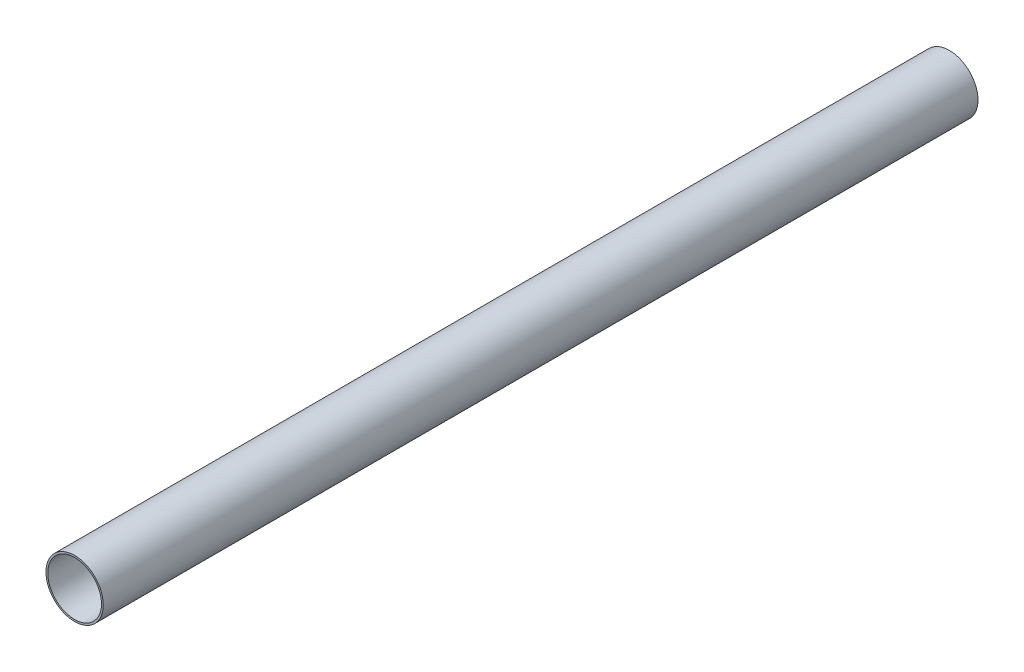
ISO-10303-21;
HEADER;
FILE_DESCRIPTION(('STEP AP214'),'2;1');
FILE_NAME('part.step','',(''),(''),'','','');
FILE_SCHEMA(('AUTOMOTIVE_DESIGN { 1 0 10303 214 1 1 1 1 }'));
ENDSEC;
DATA;
#1=APPLICATION_CONTEXT('core data for automotive mechanical design processes');
#2=APPLICATION_PROTOCOL_DEFINITION('international standard','automotive_design',2000,#1);
#3=PRODUCT_CONTEXT('',#1,'mechanical');
#4=PRODUCT('Part','Part','',(#3));
#5=PRODUCT_RELATED_PRODUCT_CATEGORY('part','',(#4));
#6=PRODUCT_DEFINITION_FORMATION('','',#4);
#7=PRODUCT_DEFINITION_CONTEXT('part definition',#1,'design');
#8=PRODUCT_DEFINITION('design','',#6,#7);
#9=PRODUCT_DEFINITION_SHAPE('','',#8);
#10=(LENGTH_UNIT() NAMED_UNIT(*) SI_UNIT(.MILLI.,.METRE.));
#11=(NAMED_UNIT(*) PLANE_ANGLE_UNIT() SI_UNIT($,.RADIAN.));
#12=(NAMED_UNIT(*) SI_UNIT($,.STERADIAN.) SOLID_ANGLE_UNIT());
#13=UNCERTAINTY_MEASURE_WITH_UNIT(LENGTH_MEASURE(1.E-05),#10,'distance_accuracy_value','');
#14=(GEOMETRIC_REPRESENTATION_CONTEXT(3) GLOBAL_UNCERTAINTY_ASSIGNED_CONTEXT((#13)) GLOBAL_UNIT_ASSIGNED_CONTEXT((#10,
#11,#12)) REPRESENTATION_CONTEXT('',''));
#15=CARTESIAN_POINT('',(0.,0.,0.));
#16=DIRECTION('',(0.,0.,1.));
#17=DIRECTION('',(1.,0.,0.));
#18=AXIS2_PLACEMENT_3D('',#15,#16,#17);
#19=CARTESIAN_POINT('',(0.,0.,387.62));
#20=DIRECTION('',(0.,0.,1.));
#21=DIRECTION('',(1.,0.,0.));
#22=AXIS2_PLACEMENT_3D('',#19,#20,#21);
#23=PLANE('',#22);
#24=CARTESIAN_POINT('',(0.,0.,387.62));
#25=DIRECTION('',(0.,0.,1.));
#26=DIRECTION('',(1.,0.,0.));
#27=AXIS2_PLACEMENT_3D('',#24,#25,#26);
#28=CIRCLE('',#27,12.7);
#29=CARTESIAN_POINT('',(12.7,0.,387.62));
#30=VERTEX_POINT('',#29);
#31=EDGE_CURVE('E10',#30,#30,#28,.T.);
#32=ORIENTED_EDGE('',*,*,#31,.T.);
#33=EDGE_LOOP('',(#32));
#34=FACE_BOUND('',#33,.T.);
#35=CARTESIAN_POINT('',(0.,0.,387.62));
#36=DIRECTION('',(0.,0.,1.));
#37=DIRECTION('',(1.,0.,0.));
#38=AXIS2_PLACEMENT_3D('',#35,#36,#37);
#39=CIRCLE('',#38,11.90625);
#40=CARTESIAN_POINT('',(11.90625,0.,387.62));
#41=VERTEX_POINT('',#40);
#42=EDGE_CURVE('E48',#41,#41,#39,.T.);
#43=ORIENTED_EDGE('',*,*,#42,.F.);
#44=EDGE_LOOP('',(#43));
#45=FACE_BOUND('',#44,.T.);
#46=ADVANCED_FACE('F37',(#34,#45),#23,.T.);
#47=CARTESIAN_POINT('',(0.,0.,0.));
#48=DIRECTION('',(0.,0.,1.));
#49=DIRECTION('',(1.,0.,0.));
#50=AXIS2_PLACEMENT_3D('',#47,#48,#49);
#51=PLANE('',#50);
#52=CARTESIAN_POINT('',(0.,0.,0.));
#53=DIRECTION('',(0.,0.,1.));
#54=DIRECTION('',(1.,0.,0.));
#55=AXIS2_PLACEMENT_3D('',#52,#53,#54);
#56=CIRCLE('',#55,12.7);
#57=CARTESIAN_POINT('',(12.7,0.,0.));
#58=VERTEX_POINT('',#57);
#59=EDGE_CURVE('E41',#58,#58,#56,.T.);
#60=ORIENTED_EDGE('',*,*,#59,.F.);
#61=EDGE_LOOP('',(#60));
#62=FACE_BOUND('',#61,.T.);
#63=CARTESIAN_POINT('',(0.,0.,0.));
#64=DIRECTION('',(0.,0.,1.));
#65=DIRECTION('',(1.,0.,0.));
#66=AXIS2_PLACEMENT_3D('',#63,#64,#65);
#67=CIRCLE('',#66,11.90625);
#68=CARTESIAN_POINT('',(11.90625,0.,0.));
#69=VERTEX_POINT('',#68);
#70=EDGE_CURVE('E50',#69,#69,#67,.T.);
#71=ORIENTED_EDGE('',*,*,#70,.T.);
#72=EDGE_LOOP('',(#71));
#73=FACE_BOUND('',#72,.T.);
#74=ADVANCED_FACE('F60',(#62,#73),#51,.F.);
#75=CARTESIAN_POINT('',(0.,0.,387.62));
#76=DIRECTION('',(0.,0.,-1.));
#77=DIRECTION('',(-1.,0.,0.));
#78=AXIS2_PLACEMENT_3D('',#75,#76,#77);
#79=CYLINDRICAL_SURFACE('',#78,12.7);
#80=ORIENTED_EDGE('',*,*,#31,.F.);
#81=EDGE_LOOP('',(#80));
#82=FACE_BOUND('',#81,.T.);
#83=ORIENTED_EDGE('',*,*,#59,.T.);
#84=EDGE_LOOP('',(#83));
#85=FACE_BOUND('',#84,.T.);
#86=ADVANCED_FACE('F39',(#82,#85),#79,.T.);
#87=CARTESIAN_POINT('',(0.,0.,387.62));
#88=DIRECTION('',(0.,0.,-1.));
#89=DIRECTION('',(-1.,0.,0.));
#90=AXIS2_PLACEMENT_3D('',#87,#88,#89);
#91=CYLINDRICAL_SURFACE('',#90,11.90625);
#92=ORIENTED_EDGE('',*,*,#42,.T.);
#93=EDGE_LOOP('',(#92));
#94=FACE_BOUND('',#93,.T.);
#95=ORIENTED_EDGE('',*,*,#70,.F.);
#96=EDGE_LOOP('',(#95));
#97=FACE_BOUND('',#96,.T.);
#98=ADVANCED_FACE('F56',(#94,#97),#91,.F.);
#99=CLOSED_SHELL('',(#46,#74,#86,#98));
#100=MANIFOLD_SOLID_BREP('B2',#99);
#101=ADVANCED_BREP_SHAPE_REPRESENTATION('',(#18,#100),#14);
#102=SHAPE_DEFINITION_REPRESENTATION(#9,#101);
ENDSEC;
END-ISO-10303-21;
